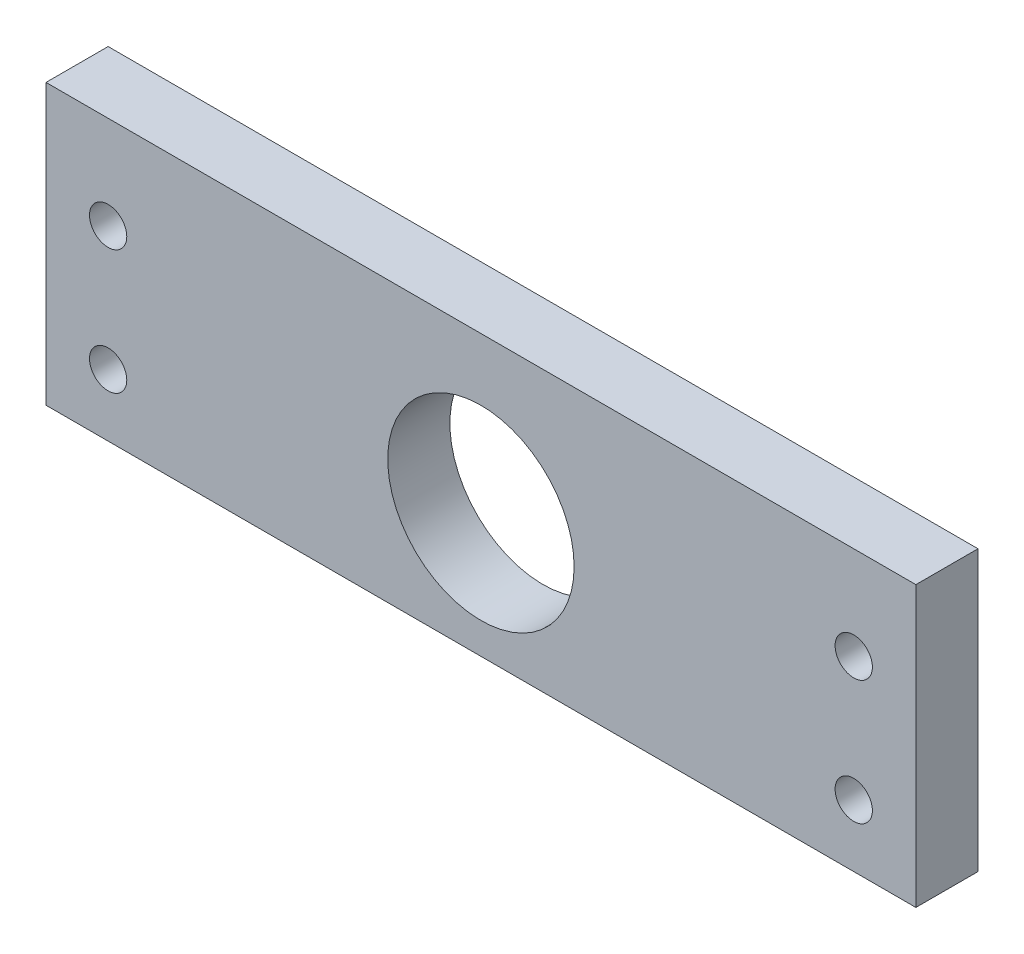
ISO-10303-21;
HEADER;
FILE_DESCRIPTION(('STEP AP214'),'2;1');
FILE_NAME('part.step','',(''),(''),'','','');
FILE_SCHEMA(('AUTOMOTIVE_DESIGN { 1 0 10303 214 1 1 1 1 }'));
ENDSEC;
DATA;
#1=APPLICATION_CONTEXT('core data for automotive mechanical design processes');
#2=APPLICATION_PROTOCOL_DEFINITION('international standard','automotive_design',2000,#1);
#3=PRODUCT_CONTEXT('',#1,'mechanical');
#4=PRODUCT('Part','Part','',(#3));
#5=PRODUCT_RELATED_PRODUCT_CATEGORY('part','',(#4));
#6=PRODUCT_DEFINITION_FORMATION('','',#4);
#7=PRODUCT_DEFINITION_CONTEXT('part definition',#1,'design');
#8=PRODUCT_DEFINITION('design','',#6,#7);
#9=PRODUCT_DEFINITION_SHAPE('','',#8);
#10=(LENGTH_UNIT() NAMED_UNIT(*) SI_UNIT(.MILLI.,.METRE.));
#11=(NAMED_UNIT(*) PLANE_ANGLE_UNIT() SI_UNIT($,.RADIAN.));
#12=(NAMED_UNIT(*) SI_UNIT($,.STERADIAN.) SOLID_ANGLE_UNIT());
#13=UNCERTAINTY_MEASURE_WITH_UNIT(LENGTH_MEASURE(1.E-05),#10,'distance_accuracy_value','');
#14=(GEOMETRIC_REPRESENTATION_CONTEXT(3) GLOBAL_UNCERTAINTY_ASSIGNED_CONTEXT((#13)) GLOBAL_UNIT_ASSIGNED_CONTEXT((#10,
#11,#12)) REPRESENTATION_CONTEXT('',''));
#15=CARTESIAN_POINT('',(0.,0.,0.));
#16=DIRECTION('',(0.,0.,1.));
#17=DIRECTION('',(1.,0.,0.));
#18=AXIS2_PLACEMENT_3D('',#15,#16,#17);
#19=CARTESIAN_POINT('',(35.,-10.,5.));
#20=DIRECTION('',(0.,0.,1.));
#21=DIRECTION('',(1.,0.,0.));
#22=AXIS2_PLACEMENT_3D('',#19,#20,#21);
#23=PLANE('',#22);
#24=CARTESIAN_POINT('',(-30.,5.,5.));
#25=DIRECTION('',(0.,0.,1.));
#26=DIRECTION('',(1.,0.,0.));
#27=AXIS2_PLACEMENT_3D('',#24,#25,#26);
#28=CIRCLE('',#27,1.5);
#29=CARTESIAN_POINT('',(-28.5,5.,5.));
#30=VERTEX_POINT('',#29);
#31=EDGE_CURVE('E125',#30,#30,#28,.T.);
#32=ORIENTED_EDGE('',*,*,#31,.F.);
#33=EDGE_LOOP('',(#32));
#34=FACE_BOUND('',#33,.T.);
#35=CARTESIAN_POINT('',(30.,-5.,5.));
#36=DIRECTION('',(0.,0.,1.));
#37=DIRECTION('',(1.,0.,0.));
#38=AXIS2_PLACEMENT_3D('',#35,#36,#37);
#39=CIRCLE('',#38,1.50000000000001);
#40=CARTESIAN_POINT('',(31.5,-5.,5.));
#41=VERTEX_POINT('',#40);
#42=EDGE_CURVE('E113',#41,#41,#39,.T.);
#43=ORIENTED_EDGE('',*,*,#42,.F.);
#44=EDGE_LOOP('',(#43));
#45=FACE_BOUND('',#44,.T.);
#46=DIRECTION('',(0.,1.,0.));
#47=VECTOR('',#46,1.);
#48=CARTESIAN_POINT('',(35.,12.5,5.));
#49=LINE('',#48,#47);
#50=CARTESIAN_POINT('',(35.,-10.,5.));
#51=VERTEX_POINT('',#50);
#52=CARTESIAN_POINT('',(35.,12.5,5.));
#53=VERTEX_POINT('',#52);
#54=EDGE_CURVE('E83',#51,#53,#49,.T.);
#55=ORIENTED_EDGE('',*,*,#54,.T.);
#56=DIRECTION('',(-1.,0.,0.));
#57=VECTOR('',#56,1.);
#58=CARTESIAN_POINT('',(-35.,12.5,5.));
#59=LINE('',#58,#57);
#60=CARTESIAN_POINT('',(-35.,12.5,5.));
#61=VERTEX_POINT('',#60);
#62=EDGE_CURVE('E78',#53,#61,#59,.T.);
#63=ORIENTED_EDGE('',*,*,#62,.T.);
#64=DIRECTION('',(0.,-1.,0.));
#65=VECTOR('',#64,1.);
#66=CARTESIAN_POINT('',(-35.,12.5,5.));
#67=LINE('',#66,#65);
#68=CARTESIAN_POINT('',(-35.,-10.,5.));
#69=VERTEX_POINT('',#68);
#70=EDGE_CURVE('E81',#61,#69,#67,.T.);
#71=ORIENTED_EDGE('',*,*,#70,.T.);
#72=DIRECTION('',(1.,0.,0.));
#73=VECTOR('',#72,1.);
#74=CARTESIAN_POINT('',(-35.,-10.,5.));
#75=LINE('',#74,#73);
#76=EDGE_CURVE('E48',#69,#51,#75,.T.);
#77=ORIENTED_EDGE('',*,*,#76,.T.);
#78=EDGE_LOOP('',(#55,#63,#71,#77));
#79=FACE_BOUND('',#78,.T.);
#80=CARTESIAN_POINT('',(0.,0.,5.));
#81=DIRECTION('',(0.,0.,1.));
#82=DIRECTION('',(1.,0.,0.));
#83=AXIS2_PLACEMENT_3D('',#80,#81,#82);
#84=CIRCLE('',#83,7.5);
#85=CARTESIAN_POINT('',(7.49999999999998,0.,5.));
#86=VERTEX_POINT('',#85);
#87=EDGE_CURVE('E98',#86,#86,#84,.T.);
#88=ORIENTED_EDGE('',*,*,#87,.F.);
#89=EDGE_LOOP('',(#88));
#90=FACE_BOUND('',#89,.T.);
#91=CARTESIAN_POINT('',(30.,5.,5.));
#92=DIRECTION('',(0.,0.,1.));
#93=DIRECTION('',(1.,0.,0.));
#94=AXIS2_PLACEMENT_3D('',#91,#92,#93);
#95=CIRCLE('',#94,1.50000000000001);
#96=CARTESIAN_POINT('',(31.5,5.,5.));
#97=VERTEX_POINT('',#96);
#98=EDGE_CURVE('E119',#97,#97,#95,.T.);
#99=ORIENTED_EDGE('',*,*,#98,.F.);
#100=EDGE_LOOP('',(#99));
#101=FACE_BOUND('',#100,.T.);
#102=CARTESIAN_POINT('',(-30.,-5.,5.));
#103=DIRECTION('',(0.,0.,1.));
#104=DIRECTION('',(1.,0.,0.));
#105=AXIS2_PLACEMENT_3D('',#102,#103,#104);
#106=CIRCLE('',#105,1.5);
#107=CARTESIAN_POINT('',(-28.5,-5.,5.));
#108=VERTEX_POINT('',#107);
#109=EDGE_CURVE('E131',#108,#108,#106,.T.);
#110=ORIENTED_EDGE('',*,*,#109,.F.);
#111=EDGE_LOOP('',(#110));
#112=FACE_BOUND('',#111,.T.);
#113=ADVANCED_FACE('F31',(#34,#45,#79,#90,#101,#112),#23,.T.);
#114=CARTESIAN_POINT('',(35.,-10.,0.));
#115=DIRECTION('',(0.,0.,1.));
#116=DIRECTION('',(1.,0.,0.));
#117=AXIS2_PLACEMENT_3D('',#114,#115,#116);
#118=PLANE('',#117);
#119=CARTESIAN_POINT('',(-30.,5.,0.));
#120=DIRECTION('',(0.,0.,1.));
#121=DIRECTION('',(1.,0.,0.));
#122=AXIS2_PLACEMENT_3D('',#119,#120,#121);
#123=CIRCLE('',#122,1.5);
#124=CARTESIAN_POINT('',(-28.5,5.,0.));
#125=VERTEX_POINT('',#124);
#126=EDGE_CURVE('E128',#125,#125,#123,.T.);
#127=ORIENTED_EDGE('',*,*,#126,.T.);
#128=EDGE_LOOP('',(#127));
#129=FACE_BOUND('',#128,.T.);
#130=CARTESIAN_POINT('',(30.,-5.,0.));
#131=DIRECTION('',(0.,0.,1.));
#132=DIRECTION('',(1.,0.,0.));
#133=AXIS2_PLACEMENT_3D('',#130,#131,#132);
#134=CIRCLE('',#133,1.50000000000001);
#135=CARTESIAN_POINT('',(31.5,-5.,0.));
#136=VERTEX_POINT('',#135);
#137=EDGE_CURVE('E116',#136,#136,#134,.T.);
#138=ORIENTED_EDGE('',*,*,#137,.T.);
#139=EDGE_LOOP('',(#138));
#140=FACE_BOUND('',#139,.T.);
#141=DIRECTION('',(0.,1.,0.));
#142=VECTOR('',#141,1.);
#143=CARTESIAN_POINT('',(35.,12.5,0.));
#144=LINE('',#143,#142);
#145=CARTESIAN_POINT('',(35.,-10.,0.));
#146=VERTEX_POINT('',#145);
#147=CARTESIAN_POINT('',(35.,12.5,0.));
#148=VERTEX_POINT('',#147);
#149=EDGE_CURVE('E95',#146,#148,#144,.T.);
#150=ORIENTED_EDGE('',*,*,#149,.F.);
#151=DIRECTION('',(1.,0.,0.));
#152=VECTOR('',#151,1.);
#153=CARTESIAN_POINT('',(-35.,-10.,0.));
#154=LINE('',#153,#152);
#155=CARTESIAN_POINT('',(-35.,-10.,0.));
#156=VERTEX_POINT('',#155);
#157=EDGE_CURVE('E71',#156,#146,#154,.T.);
#158=ORIENTED_EDGE('',*,*,#157,.F.);
#159=DIRECTION('',(0.,-1.,0.));
#160=VECTOR('',#159,1.);
#161=CARTESIAN_POINT('',(-35.,12.5,0.));
#162=LINE('',#161,#160);
#163=CARTESIAN_POINT('',(-35.,12.5,0.));
#164=VERTEX_POINT('',#163);
#165=EDGE_CURVE('E65',#164,#156,#162,.T.);
#166=ORIENTED_EDGE('',*,*,#165,.F.);
#167=DIRECTION('',(-1.,0.,0.));
#168=VECTOR('',#167,1.);
#169=CARTESIAN_POINT('',(-35.,12.5,0.));
#170=LINE('',#169,#168);
#171=EDGE_CURVE('E87',#148,#164,#170,.T.);
#172=ORIENTED_EDGE('',*,*,#171,.F.);
#173=EDGE_LOOP('',(#150,#158,#166,#172));
#174=FACE_BOUND('',#173,.T.);
#175=CARTESIAN_POINT('',(0.,0.,0.));
#176=DIRECTION('',(0.,0.,1.));
#177=DIRECTION('',(1.,0.,0.));
#178=AXIS2_PLACEMENT_3D('',#175,#176,#177);
#179=CIRCLE('',#178,7.5);
#180=CARTESIAN_POINT('',(7.49999999999998,0.,0.));
#181=VERTEX_POINT('',#180);
#182=EDGE_CURVE('E110',#181,#181,#179,.T.);
#183=ORIENTED_EDGE('',*,*,#182,.T.);
#184=EDGE_LOOP('',(#183));
#185=FACE_BOUND('',#184,.T.);
#186=CARTESIAN_POINT('',(30.,5.,0.));
#187=DIRECTION('',(0.,0.,1.));
#188=DIRECTION('',(1.,0.,0.));
#189=AXIS2_PLACEMENT_3D('',#186,#187,#188);
#190=CIRCLE('',#189,1.50000000000001);
#191=CARTESIAN_POINT('',(31.5,5.,0.));
#192=VERTEX_POINT('',#191);
#193=EDGE_CURVE('E122',#192,#192,#190,.T.);
#194=ORIENTED_EDGE('',*,*,#193,.T.);
#195=EDGE_LOOP('',(#194));
#196=FACE_BOUND('',#195,.T.);
#197=CARTESIAN_POINT('',(-30.,-5.,0.));
#198=DIRECTION('',(0.,0.,1.));
#199=DIRECTION('',(1.,0.,0.));
#200=AXIS2_PLACEMENT_3D('',#197,#198,#199);
#201=CIRCLE('',#200,1.5);
#202=CARTESIAN_POINT('',(-28.5,-5.,0.));
#203=VERTEX_POINT('',#202);
#204=EDGE_CURVE('E134',#203,#203,#201,.T.);
#205=ORIENTED_EDGE('',*,*,#204,.T.);
#206=EDGE_LOOP('',(#205));
#207=FACE_BOUND('',#206,.T.);
#208=ADVANCED_FACE('F106',(#129,#140,#174,#185,#196,#207),#118,.F.);
#209=CARTESIAN_POINT('',(35.,12.5,5.));
#210=DIRECTION('',(-1.,0.,0.));
#211=DIRECTION('',(0.,0.,1.));
#212=AXIS2_PLACEMENT_3D('',#209,#210,#211);
#213=PLANE('',#212);
#214=ORIENTED_EDGE('',*,*,#149,.T.);
#215=DIRECTION('',(0.,0.,-1.));
#216=VECTOR('',#215,1.);
#217=CARTESIAN_POINT('',(35.,12.5,5.));
#218=LINE('',#217,#216);
#219=EDGE_CURVE('E11',#53,#148,#218,.T.);
#220=ORIENTED_EDGE('',*,*,#219,.F.);
#221=ORIENTED_EDGE('',*,*,#54,.F.);
#222=DIRECTION('',(0.,0.,-1.));
#223=VECTOR('',#222,1.);
#224=CARTESIAN_POINT('',(35.,-10.,5.));
#225=LINE('',#224,#223);
#226=EDGE_CURVE('E91',#51,#146,#225,.T.);
#227=ORIENTED_EDGE('',*,*,#226,.T.);
#228=EDGE_LOOP('',(#214,#220,#221,#227));
#229=FACE_BOUND('',#228,.T.);
#230=ADVANCED_FACE('F33',(#229),#213,.F.);
#231=CARTESIAN_POINT('',(-35.,12.5,5.));
#232=DIRECTION('',(0.,-1.,0.));
#233=DIRECTION('',(0.,0.,-1.));
#234=AXIS2_PLACEMENT_3D('',#231,#232,#233);
#235=PLANE('',#234);
#236=ORIENTED_EDGE('',*,*,#171,.T.);
#237=DIRECTION('',(0.,0.,-1.));
#238=VECTOR('',#237,1.);
#239=CARTESIAN_POINT('',(-35.,12.5,5.));
#240=LINE('',#239,#238);
#241=EDGE_CURVE('E40',#61,#164,#240,.T.);
#242=ORIENTED_EDGE('',*,*,#241,.F.);
#243=ORIENTED_EDGE('',*,*,#62,.F.);
#244=ORIENTED_EDGE('',*,*,#219,.T.);
#245=EDGE_LOOP('',(#236,#242,#243,#244));
#246=FACE_BOUND('',#245,.T.);
#247=ADVANCED_FACE('F86',(#246),#235,.F.);
#248=CARTESIAN_POINT('',(-35.,12.5,5.));
#249=DIRECTION('',(1.,0.,0.));
#250=DIRECTION('',(0.,0.,-1.));
#251=AXIS2_PLACEMENT_3D('',#248,#249,#250);
#252=PLANE('',#251);
#253=ORIENTED_EDGE('',*,*,#165,.T.);
#254=DIRECTION('',(0.,0.,-1.));
#255=VECTOR('',#254,1.);
#256=CARTESIAN_POINT('',(-35.,-10.,5.));
#257=LINE('',#256,#255);
#258=EDGE_CURVE('E88',#69,#156,#257,.T.);
#259=ORIENTED_EDGE('',*,*,#258,.F.);
#260=ORIENTED_EDGE('',*,*,#70,.F.);
#261=ORIENTED_EDGE('',*,*,#241,.T.);
#262=EDGE_LOOP('',(#253,#259,#260,#261));
#263=FACE_BOUND('',#262,.T.);
#264=ADVANCED_FACE('F89',(#263),#252,.F.);
#265=CARTESIAN_POINT('',(-35.,-10.,5.));
#266=DIRECTION('',(0.,1.,0.));
#267=DIRECTION('',(0.,0.,1.));
#268=AXIS2_PLACEMENT_3D('',#265,#266,#267);
#269=PLANE('',#268);
#270=ORIENTED_EDGE('',*,*,#157,.T.);
#271=ORIENTED_EDGE('',*,*,#226,.F.);
#272=ORIENTED_EDGE('',*,*,#76,.F.);
#273=ORIENTED_EDGE('',*,*,#258,.T.);
#274=EDGE_LOOP('',(#270,#271,#272,#273));
#275=FACE_BOUND('',#274,.T.);
#276=ADVANCED_FACE('F103',(#275),#269,.F.);
#277=CARTESIAN_POINT('',(0.,0.,5.));
#278=DIRECTION('',(0.,0.,-1.));
#279=DIRECTION('',(-1.,0.,0.));
#280=AXIS2_PLACEMENT_3D('',#277,#278,#279);
#281=CYLINDRICAL_SURFACE('',#280,7.5);
#282=ORIENTED_EDGE('',*,*,#87,.T.);
#283=EDGE_LOOP('',(#282));
#284=FACE_BOUND('',#283,.T.);
#285=ORIENTED_EDGE('',*,*,#182,.F.);
#286=EDGE_LOOP('',(#285));
#287=FACE_BOUND('',#286,.T.);
#288=ADVANCED_FACE('F154',(#284,#287),#281,.F.);
#289=CARTESIAN_POINT('',(30.,-5.,5.));
#290=DIRECTION('',(0.,0.,-1.));
#291=DIRECTION('',(-1.,0.,0.));
#292=AXIS2_PLACEMENT_3D('',#289,#290,#291);
#293=CYLINDRICAL_SURFACE('',#292,1.50000000000001);
#294=ORIENTED_EDGE('',*,*,#42,.T.);
#295=EDGE_LOOP('',(#294));
#296=FACE_BOUND('',#295,.T.);
#297=ORIENTED_EDGE('',*,*,#137,.F.);
#298=EDGE_LOOP('',(#297));
#299=FACE_BOUND('',#298,.T.);
#300=ADVANCED_FACE('F200',(#296,#299),#293,.F.);
#301=CARTESIAN_POINT('',(30.,5.,5.));
#302=DIRECTION('',(0.,0.,-1.));
#303=DIRECTION('',(-1.,0.,0.));
#304=AXIS2_PLACEMENT_3D('',#301,#302,#303);
#305=CYLINDRICAL_SURFACE('',#304,1.50000000000001);
#306=ORIENTED_EDGE('',*,*,#98,.T.);
#307=EDGE_LOOP('',(#306));
#308=FACE_BOUND('',#307,.T.);
#309=ORIENTED_EDGE('',*,*,#193,.F.);
#310=EDGE_LOOP('',(#309));
#311=FACE_BOUND('',#310,.T.);
#312=ADVANCED_FACE('F208',(#308,#311),#305,.F.);
#313=CARTESIAN_POINT('',(-30.,5.,5.));
#314=DIRECTION('',(0.,0.,-1.));
#315=DIRECTION('',(-1.,0.,0.));
#316=AXIS2_PLACEMENT_3D('',#313,#314,#315);
#317=CYLINDRICAL_SURFACE('',#316,1.5);
#318=ORIENTED_EDGE('',*,*,#31,.T.);
#319=EDGE_LOOP('',(#318));
#320=FACE_BOUND('',#319,.T.);
#321=ORIENTED_EDGE('',*,*,#126,.F.);
#322=EDGE_LOOP('',(#321));
#323=FACE_BOUND('',#322,.T.);
#324=ADVANCED_FACE('F216',(#320,#323),#317,.F.);
#325=CARTESIAN_POINT('',(-30.,-5.,5.));
#326=DIRECTION('',(0.,0.,-1.));
#327=DIRECTION('',(-1.,0.,0.));
#328=AXIS2_PLACEMENT_3D('',#325,#326,#327);
#329=CYLINDRICAL_SURFACE('',#328,1.5);
#330=ORIENTED_EDGE('',*,*,#109,.T.);
#331=EDGE_LOOP('',(#330));
#332=FACE_BOUND('',#331,.T.);
#333=ORIENTED_EDGE('',*,*,#204,.F.);
#334=EDGE_LOOP('',(#333));
#335=FACE_BOUND('',#334,.T.);
#336=ADVANCED_FACE('F140',(#332,#335),#329,.F.);
#337=CLOSED_SHELL('',(#113,#208,#230,#247,#264,#276,#288,#300,#312,#324,#336));
#338=MANIFOLD_SOLID_BREP('B2',#337);
#339=ADVANCED_BREP_SHAPE_REPRESENTATION('',(#18,#338),#14);
#340=SHAPE_DEFINITION_REPRESENTATION(#9,#339);
ENDSEC;
END-ISO-10303-21;
